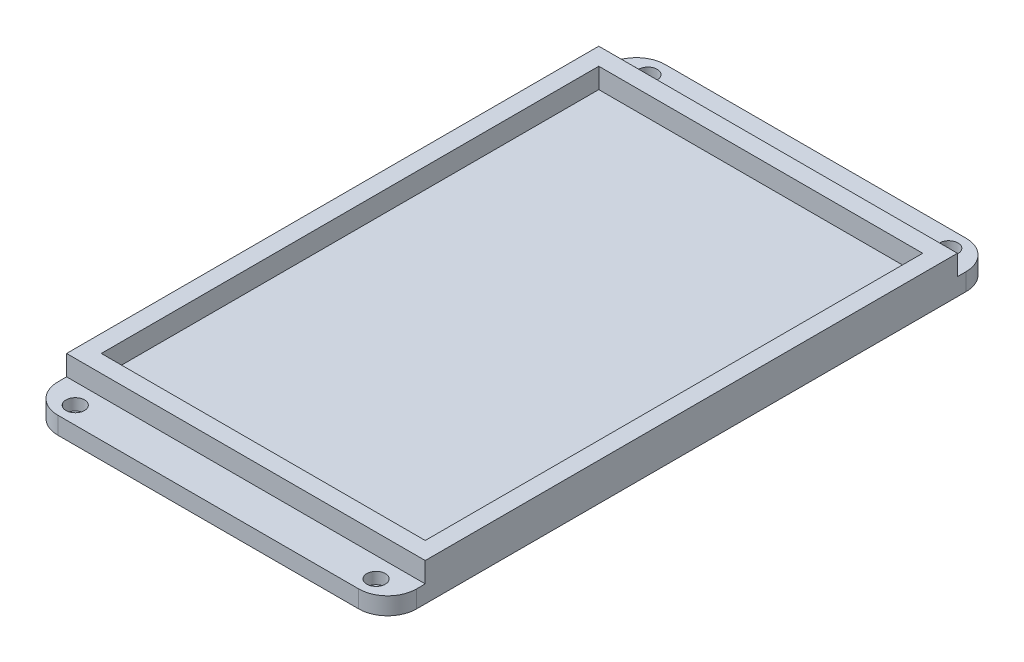
ISO-10303-21;
HEADER;
FILE_DESCRIPTION(('STEP AP214'),'2;1');
FILE_NAME('part.step','',(''),(''),'','','');
FILE_SCHEMA(('AUTOMOTIVE_DESIGN { 1 0 10303 214 1 1 1 1 }'));
ENDSEC;
DATA;
#1=APPLICATION_CONTEXT('core data for automotive mechanical design processes');
#2=APPLICATION_PROTOCOL_DEFINITION('international standard','automotive_design',2000,#1);
#3=PRODUCT_CONTEXT('',#1,'mechanical');
#4=PRODUCT('Part','Part','',(#3));
#5=PRODUCT_RELATED_PRODUCT_CATEGORY('part','',(#4));
#6=PRODUCT_DEFINITION_FORMATION('','',#4);
#7=PRODUCT_DEFINITION_CONTEXT('part definition',#1,'design');
#8=PRODUCT_DEFINITION('design','',#6,#7);
#9=PRODUCT_DEFINITION_SHAPE('','',#8);
#10=(LENGTH_UNIT() NAMED_UNIT(*) SI_UNIT(.MILLI.,.METRE.));
#11=(NAMED_UNIT(*) PLANE_ANGLE_UNIT() SI_UNIT($,.RADIAN.));
#12=(NAMED_UNIT(*) SI_UNIT($,.STERADIAN.) SOLID_ANGLE_UNIT());
#13=UNCERTAINTY_MEASURE_WITH_UNIT(LENGTH_MEASURE(1.E-05),#10,'distance_accuracy_value','');
#14=(GEOMETRIC_REPRESENTATION_CONTEXT(3) GLOBAL_UNCERTAINTY_ASSIGNED_CONTEXT((#13)) GLOBAL_UNIT_ASSIGNED_CONTEXT((#10,
#11,#12)) REPRESENTATION_CONTEXT('',''));
#15=CARTESIAN_POINT('',(0.,0.,0.));
#16=DIRECTION('',(0.,0.,1.));
#17=DIRECTION('',(1.,0.,0.));
#18=AXIS2_PLACEMENT_3D('',#15,#16,#17);
#19=CARTESIAN_POINT('',(0.,3.5,0.));
#20=DIRECTION('',(0.,-1.,0.));
#21=DIRECTION('',(0.,0.,-1.));
#22=AXIS2_PLACEMENT_3D('',#19,#20,#21);
#23=PLANE('',#22);
#24=DIRECTION('',(0.,0.,-1.));
#25=VECTOR('',#24,1.);
#26=CARTESIAN_POINT('',(31.,3.5,46.));
#27=LINE('',#26,#25);
#28=CARTESIAN_POINT('',(31.,3.5,46.));
#29=VERTEX_POINT('',#28);
#30=CARTESIAN_POINT('',(31.,3.5,-46.));
#31=VERTEX_POINT('',#30);
#32=EDGE_CURVE('E262',#29,#31,#27,.T.);
#33=ORIENTED_EDGE('',*,*,#32,.T.);
#34=DIRECTION('',(-1.,0.,0.));
#35=VECTOR('',#34,1.);
#36=CARTESIAN_POINT('',(-31.,3.5,-46.));
#37=LINE('',#36,#35);
#38=CARTESIAN_POINT('',(-31.,3.5,-46.));
#39=VERTEX_POINT('',#38);
#40=EDGE_CURVE('E178',#31,#39,#37,.T.);
#41=ORIENTED_EDGE('',*,*,#40,.T.);
#42=DIRECTION('',(0.,0.,1.));
#43=VECTOR('',#42,1.);
#44=CARTESIAN_POINT('',(-31.,3.5,46.));
#45=LINE('',#44,#43);
#46=CARTESIAN_POINT('',(-31.,3.5,46.));
#47=VERTEX_POINT('',#46);
#48=EDGE_CURVE('E265',#39,#47,#45,.T.);
#49=ORIENTED_EDGE('',*,*,#48,.T.);
#50=DIRECTION('',(1.,0.,0.));
#51=VECTOR('',#50,1.);
#52=CARTESIAN_POINT('',(-31.,3.5,46.));
#53=LINE('',#52,#51);
#54=EDGE_CURVE('E267',#47,#29,#53,.T.);
#55=ORIENTED_EDGE('',*,*,#54,.T.);
#56=EDGE_LOOP('',(#33,#41,#49,#55));
#57=FACE_BOUND('',#56,.T.);
#58=DIRECTION('',(0.,0.,-1.));
#59=VECTOR('',#58,1.);
#60=CARTESIAN_POINT('',(28.,3.5,43.));
#61=LINE('',#60,#59);
#62=CARTESIAN_POINT('',(28.,3.5,43.));
#63=VERTEX_POINT('',#62);
#64=CARTESIAN_POINT('',(28.,3.5,-43.));
#65=VERTEX_POINT('',#64);
#66=EDGE_CURVE('E230',#63,#65,#61,.T.);
#67=ORIENTED_EDGE('',*,*,#66,.F.);
#68=DIRECTION('',(1.,0.,0.));
#69=VECTOR('',#68,1.);
#70=CARTESIAN_POINT('',(-28.,3.5,43.));
#71=LINE('',#70,#69);
#72=CARTESIAN_POINT('',(-28.,3.5,43.));
#73=VERTEX_POINT('',#72);
#74=EDGE_CURVE('E238',#73,#63,#71,.T.);
#75=ORIENTED_EDGE('',*,*,#74,.F.);
#76=DIRECTION('',(0.,0.,1.));
#77=VECTOR('',#76,1.);
#78=CARTESIAN_POINT('',(-28.,3.5,43.));
#79=LINE('',#78,#77);
#80=CARTESIAN_POINT('',(-28.,3.5,-43.));
#81=VERTEX_POINT('',#80);
#82=EDGE_CURVE('E235',#81,#73,#79,.T.);
#83=ORIENTED_EDGE('',*,*,#82,.F.);
#84=DIRECTION('',(-1.,0.,0.));
#85=VECTOR('',#84,1.);
#86=CARTESIAN_POINT('',(-28.,3.5,-43.));
#87=LINE('',#86,#85);
#88=EDGE_CURVE('E232',#65,#81,#87,.T.);
#89=ORIENTED_EDGE('',*,*,#88,.F.);
#90=EDGE_LOOP('',(#67,#75,#83,#89));
#91=FACE_BOUND('',#90,.T.);
#92=ADVANCED_FACE('F38',(#57,#91),#23,.F.);
#93=CARTESIAN_POINT('',(31.,3.5,46.));
#94=DIRECTION('',(-1.,0.,0.));
#95=DIRECTION('',(0.,0.,1.));
#96=AXIS2_PLACEMENT_3D('',#93,#94,#95);
#97=PLANE('',#96);
#98=DIRECTION('',(0.,0.,1.));
#99=VECTOR('',#98,1.);
#100=CARTESIAN_POINT('',(31.,-3.,-52.5));
#101=LINE('',#100,#99);
#102=CARTESIAN_POINT('',(31.,-3.,-47.5));
#103=VERTEX_POINT('',#102);
#104=CARTESIAN_POINT('',(31.,-3.,47.5));
#105=VERTEX_POINT('',#104);
#106=EDGE_CURVE('E229',#103,#105,#101,.T.);
#107=ORIENTED_EDGE('',*,*,#106,.F.);
#108=DIRECTION('',(0.,1.,0.));
#109=VECTOR('',#108,1.);
#110=CARTESIAN_POINT('',(31.,3.5,-47.5));
#111=LINE('',#110,#109);
#112=CARTESIAN_POINT('',(31.,0.,-47.5));
#113=VERTEX_POINT('',#112);
#114=EDGE_CURVE('E161',#103,#113,#111,.T.);
#115=ORIENTED_EDGE('',*,*,#114,.T.);
#116=DIRECTION('',(0.,0.,1.));
#117=VECTOR('',#116,1.);
#118=CARTESIAN_POINT('',(31.,0.,-52.5));
#119=LINE('',#118,#117);
#120=CARTESIAN_POINT('',(31.,0.,-46.));
#121=VERTEX_POINT('',#120);
#122=EDGE_CURVE('E153',#113,#121,#119,.T.);
#123=ORIENTED_EDGE('',*,*,#122,.T.);
#124=DIRECTION('',(0.,-1.,0.));
#125=VECTOR('',#124,1.);
#126=CARTESIAN_POINT('',(31.,3.5,-46.));
#127=LINE('',#126,#125);
#128=EDGE_CURVE('E159',#31,#121,#127,.T.);
#129=ORIENTED_EDGE('',*,*,#128,.F.);
#130=ORIENTED_EDGE('',*,*,#32,.F.);
#131=DIRECTION('',(0.,-1.,0.));
#132=VECTOR('',#131,1.);
#133=CARTESIAN_POINT('',(31.,3.5,46.));
#134=LINE('',#133,#132);
#135=CARTESIAN_POINT('',(31.,0.,46.));
#136=VERTEX_POINT('',#135);
#137=EDGE_CURVE('E268',#29,#136,#134,.T.);
#138=ORIENTED_EDGE('',*,*,#137,.T.);
#139=CARTESIAN_POINT('',(31.,0.,47.5));
#140=VERTEX_POINT('',#139);
#141=EDGE_CURVE('E164',#136,#140,#119,.T.);
#142=ORIENTED_EDGE('',*,*,#141,.T.);
#143=DIRECTION('',(0.,1.,0.));
#144=VECTOR('',#143,1.);
#145=CARTESIAN_POINT('',(31.,3.5,47.5));
#146=LINE('',#145,#144);
#147=EDGE_CURVE('E180',#140,#105,#146,.F.);
#148=ORIENTED_EDGE('',*,*,#147,.T.);
#149=EDGE_LOOP('',(#107,#115,#123,#129,#130,#138,#142,#148));
#150=FACE_BOUND('',#149,.T.);
#151=ADVANCED_FACE('F156',(#150),#97,.F.);
#152=CARTESIAN_POINT('',(-31.,3.5,-46.));
#153=DIRECTION('',(0.,0.,1.));
#154=DIRECTION('',(1.,0.,0.));
#155=AXIS2_PLACEMENT_3D('',#152,#153,#154);
#156=PLANE('',#155);
#157=DIRECTION('',(-1.,0.,0.));
#158=VECTOR('',#157,1.);
#159=CARTESIAN_POINT('',(-31.,0.,-46.));
#160=LINE('',#159,#158);
#161=CARTESIAN_POINT('',(-31.,0.,-46.));
#162=VERTEX_POINT('',#161);
#163=EDGE_CURVE('E167',#121,#162,#160,.T.);
#164=ORIENTED_EDGE('',*,*,#163,.T.);
#165=DIRECTION('',(0.,-1.,0.));
#166=VECTOR('',#165,1.);
#167=CARTESIAN_POINT('',(-31.,3.5,-46.));
#168=LINE('',#167,#166);
#169=EDGE_CURVE('E181',#39,#162,#168,.T.);
#170=ORIENTED_EDGE('',*,*,#169,.F.);
#171=ORIENTED_EDGE('',*,*,#40,.F.);
#172=ORIENTED_EDGE('',*,*,#128,.T.);
#173=EDGE_LOOP('',(#164,#170,#171,#172));
#174=FACE_BOUND('',#173,.T.);
#175=ADVANCED_FACE('F177',(#174),#156,.F.);
#176=CARTESIAN_POINT('',(-31.,3.5,46.));
#177=DIRECTION('',(1.,0.,0.));
#178=DIRECTION('',(0.,0.,-1.));
#179=AXIS2_PLACEMENT_3D('',#176,#177,#178);
#180=PLANE('',#179);
#181=DIRECTION('',(0.,0.,-1.));
#182=VECTOR('',#181,1.);
#183=CARTESIAN_POINT('',(-31.,0.,-52.5));
#184=LINE('',#183,#182);
#185=CARTESIAN_POINT('',(-31.,0.,-47.5));
#186=VERTEX_POINT('',#185);
#187=EDGE_CURVE('E170',#162,#186,#184,.T.);
#188=ORIENTED_EDGE('',*,*,#187,.T.);
#189=DIRECTION('',(0.,1.,0.));
#190=VECTOR('',#189,1.);
#191=CARTESIAN_POINT('',(-31.,3.5,-47.5));
#192=LINE('',#191,#190);
#193=CARTESIAN_POINT('',(-31.,-3.,-47.5));
#194=VERTEX_POINT('',#193);
#195=EDGE_CURVE('E209',#186,#194,#192,.F.);
#196=ORIENTED_EDGE('',*,*,#195,.T.);
#197=DIRECTION('',(0.,0.,-1.));
#198=VECTOR('',#197,1.);
#199=CARTESIAN_POINT('',(-31.,-3.,-52.5));
#200=LINE('',#199,#198);
#201=CARTESIAN_POINT('',(-31.,-3.,47.5));
#202=VERTEX_POINT('',#201);
#203=EDGE_CURVE('E301',#202,#194,#200,.T.);
#204=ORIENTED_EDGE('',*,*,#203,.F.);
#205=DIRECTION('',(0.,1.,0.));
#206=VECTOR('',#205,1.);
#207=CARTESIAN_POINT('',(-31.,3.5,47.5));
#208=LINE('',#207,#206);
#209=CARTESIAN_POINT('',(-31.,0.,47.5));
#210=VERTEX_POINT('',#209);
#211=EDGE_CURVE('E206',#202,#210,#208,.T.);
#212=ORIENTED_EDGE('',*,*,#211,.T.);
#213=CARTESIAN_POINT('',(-31.,0.,46.));
#214=VERTEX_POINT('',#213);
#215=EDGE_CURVE('E222',#210,#214,#184,.T.);
#216=ORIENTED_EDGE('',*,*,#215,.T.);
#217=DIRECTION('',(0.,-1.,0.));
#218=VECTOR('',#217,1.);
#219=CARTESIAN_POINT('',(-31.,3.5,46.));
#220=LINE('',#219,#218);
#221=EDGE_CURVE('E184',#47,#214,#220,.T.);
#222=ORIENTED_EDGE('',*,*,#221,.F.);
#223=ORIENTED_EDGE('',*,*,#48,.F.);
#224=ORIENTED_EDGE('',*,*,#169,.T.);
#225=EDGE_LOOP('',(#188,#196,#204,#212,#216,#222,#223,#224));
#226=FACE_BOUND('',#225,.T.);
#227=ADVANCED_FACE('F282',(#226),#180,.F.);
#228=CARTESIAN_POINT('',(-31.,3.5,46.));
#229=DIRECTION('',(0.,0.,-1.));
#230=DIRECTION('',(-1.,0.,0.));
#231=AXIS2_PLACEMENT_3D('',#228,#229,#230);
#232=PLANE('',#231);
#233=DIRECTION('',(1.,0.,0.));
#234=VECTOR('',#233,1.);
#235=CARTESIAN_POINT('',(-31.,0.,46.));
#236=LINE('',#235,#234);
#237=EDGE_CURVE('E174',#214,#136,#236,.T.);
#238=ORIENTED_EDGE('',*,*,#237,.T.);
#239=ORIENTED_EDGE('',*,*,#137,.F.);
#240=ORIENTED_EDGE('',*,*,#54,.F.);
#241=ORIENTED_EDGE('',*,*,#221,.T.);
#242=EDGE_LOOP('',(#238,#239,#240,#241));
#243=FACE_BOUND('',#242,.T.);
#244=ADVANCED_FACE('F277',(#243),#232,.F.);
#245=CARTESIAN_POINT('',(28.,3.5,43.));
#246=DIRECTION('',(-1.,0.,0.));
#247=DIRECTION('',(0.,0.,1.));
#248=AXIS2_PLACEMENT_3D('',#245,#246,#247);
#249=PLANE('',#248);
#250=DIRECTION('',(0.,0.,-1.));
#251=VECTOR('',#250,1.);
#252=CARTESIAN_POINT('',(28.,0.,43.));
#253=LINE('',#252,#251);
#254=CARTESIAN_POINT('',(28.,0.,43.));
#255=VERTEX_POINT('',#254);
#256=CARTESIAN_POINT('',(28.,0.,-43.));
#257=VERTEX_POINT('',#256);
#258=EDGE_CURVE('E241',#255,#257,#253,.T.);
#259=ORIENTED_EDGE('',*,*,#258,.F.);
#260=DIRECTION('',(0.,-1.,0.));
#261=VECTOR('',#260,1.);
#262=CARTESIAN_POINT('',(28.,3.5,43.));
#263=LINE('',#262,#261);
#264=EDGE_CURVE('E240',#63,#255,#263,.T.);
#265=ORIENTED_EDGE('',*,*,#264,.F.);
#266=ORIENTED_EDGE('',*,*,#66,.T.);
#267=DIRECTION('',(0.,-1.,0.));
#268=VECTOR('',#267,1.);
#269=CARTESIAN_POINT('',(28.,3.5,-43.));
#270=LINE('',#269,#268);
#271=EDGE_CURVE('E175',#65,#257,#270,.T.);
#272=ORIENTED_EDGE('',*,*,#271,.T.);
#273=EDGE_LOOP('',(#259,#265,#266,#272));
#274=FACE_BOUND('',#273,.T.);
#275=ADVANCED_FACE('F339',(#274),#249,.T.);
#276=CARTESIAN_POINT('',(-28.,3.5,-43.));
#277=DIRECTION('',(0.,0.,1.));
#278=DIRECTION('',(1.,0.,0.));
#279=AXIS2_PLACEMENT_3D('',#276,#277,#278);
#280=PLANE('',#279);
#281=DIRECTION('',(-1.,0.,0.));
#282=VECTOR('',#281,1.);
#283=CARTESIAN_POINT('',(-28.,0.,-43.));
#284=LINE('',#283,#282);
#285=CARTESIAN_POINT('',(-28.,0.,-43.));
#286=VERTEX_POINT('',#285);
#287=EDGE_CURVE('E244',#257,#286,#284,.T.);
#288=ORIENTED_EDGE('',*,*,#287,.F.);
#289=ORIENTED_EDGE('',*,*,#271,.F.);
#290=ORIENTED_EDGE('',*,*,#88,.T.);
#291=DIRECTION('',(0.,-1.,0.));
#292=VECTOR('',#291,1.);
#293=CARTESIAN_POINT('',(-28.,3.5,-43.));
#294=LINE('',#293,#292);
#295=EDGE_CURVE('E258',#81,#286,#294,.T.);
#296=ORIENTED_EDGE('',*,*,#295,.T.);
#297=EDGE_LOOP('',(#288,#289,#290,#296));
#298=FACE_BOUND('',#297,.T.);
#299=ADVANCED_FACE('F371',(#298),#280,.T.);
#300=CARTESIAN_POINT('',(-28.,3.5,43.));
#301=DIRECTION('',(1.,0.,0.));
#302=DIRECTION('',(0.,0.,-1.));
#303=AXIS2_PLACEMENT_3D('',#300,#301,#302);
#304=PLANE('',#303);
#305=DIRECTION('',(0.,0.,1.));
#306=VECTOR('',#305,1.);
#307=CARTESIAN_POINT('',(-28.,0.,43.));
#308=LINE('',#307,#306);
#309=CARTESIAN_POINT('',(-28.,0.,43.));
#310=VERTEX_POINT('',#309);
#311=EDGE_CURVE('E248',#286,#310,#308,.T.);
#312=ORIENTED_EDGE('',*,*,#311,.F.);
#313=ORIENTED_EDGE('',*,*,#295,.F.);
#314=ORIENTED_EDGE('',*,*,#82,.T.);
#315=DIRECTION('',(0.,-1.,0.));
#316=VECTOR('',#315,1.);
#317=CARTESIAN_POINT('',(-28.,3.5,43.));
#318=LINE('',#317,#316);
#319=EDGE_CURVE('E255',#73,#310,#318,.T.);
#320=ORIENTED_EDGE('',*,*,#319,.T.);
#321=EDGE_LOOP('',(#312,#313,#314,#320));
#322=FACE_BOUND('',#321,.T.);
#323=ADVANCED_FACE('F368',(#322),#304,.T.);
#324=CARTESIAN_POINT('',(-28.,3.5,43.));
#325=DIRECTION('',(0.,0.,-1.));
#326=DIRECTION('',(-1.,0.,0.));
#327=AXIS2_PLACEMENT_3D('',#324,#325,#326);
#328=PLANE('',#327);
#329=DIRECTION('',(1.,0.,0.));
#330=VECTOR('',#329,1.);
#331=CARTESIAN_POINT('',(-28.,0.,43.));
#332=LINE('',#331,#330);
#333=EDGE_CURVE('E233',#310,#255,#332,.T.);
#334=ORIENTED_EDGE('',*,*,#333,.F.);
#335=ORIENTED_EDGE('',*,*,#319,.F.);
#336=ORIENTED_EDGE('',*,*,#74,.T.);
#337=ORIENTED_EDGE('',*,*,#264,.T.);
#338=EDGE_LOOP('',(#334,#335,#336,#337));
#339=FACE_BOUND('',#338,.T.);
#340=ADVANCED_FACE('F361',(#339),#328,.T.);
#341=CARTESIAN_POINT('',(0.,0.,0.));
#342=DIRECTION('',(0.,1.,0.));
#343=DIRECTION('',(0.,0.,1.));
#344=AXIS2_PLACEMENT_3D('',#341,#342,#343);
#345=PLANE('',#344);
#346=ORIENTED_EDGE('',*,*,#311,.T.);
#347=ORIENTED_EDGE('',*,*,#333,.T.);
#348=ORIENTED_EDGE('',*,*,#258,.T.);
#349=ORIENTED_EDGE('',*,*,#287,.T.);
#350=EDGE_LOOP('',(#346,#347,#348,#349));
#351=FACE_BOUND('',#350,.T.);
#352=ADVANCED_FACE('F359',(#351),#345,.T.);
#353=CARTESIAN_POINT('',(-26.,0.,49.5));
#354=DIRECTION('',(0.,1.,0.));
#355=DIRECTION('',(0.,0.,-1.));
#356=AXIS2_PLACEMENT_3D('',#353,#354,#355);
#357=CIRCLE('',#356,1.6);
#358=CARTESIAN_POINT('',(-26.,0.,47.9));
#359=VERTEX_POINT('',#358);
#360=EDGE_CURVE('E633',#359,#359,#357,.T.);
#361=ORIENTED_EDGE('',*,*,#360,.F.);
#362=EDGE_LOOP('',(#361));
#363=FACE_BOUND('',#362,.T.);
#364=CARTESIAN_POINT('',(26.,0.,49.5));
#365=DIRECTION('',(0.,1.,0.));
#366=DIRECTION('',(0.,0.,1.));
#367=AXIS2_PLACEMENT_3D('',#364,#365,#366);
#368=CIRCLE('',#367,1.6);
#369=CARTESIAN_POINT('',(26.,0.,51.1));
#370=VERTEX_POINT('',#369);
#371=EDGE_CURVE('E639',#370,#370,#368,.T.);
#372=ORIENTED_EDGE('',*,*,#371,.F.);
#373=EDGE_LOOP('',(#372));
#374=FACE_BOUND('',#373,.T.);
#375=ORIENTED_EDGE('',*,*,#215,.F.);
#376=CARTESIAN_POINT('',(-26.,0.,47.5));
#377=DIRECTION('',(0.,1.,0.));
#378=DIRECTION('',(0.,0.,1.));
#379=AXIS2_PLACEMENT_3D('',#376,#377,#378);
#380=CIRCLE('',#379,5.);
#381=CARTESIAN_POINT('',(-26.,0.,52.5));
#382=VERTEX_POINT('',#381);
#383=EDGE_CURVE('E53',#210,#382,#380,.T.);
#384=ORIENTED_EDGE('',*,*,#383,.T.);
#385=DIRECTION('',(-1.,0.,0.));
#386=VECTOR('',#385,1.);
#387=CARTESIAN_POINT('',(-31.,0.,52.5));
#388=LINE('',#387,#386);
#389=CARTESIAN_POINT('',(26.,0.,52.5));
#390=VERTEX_POINT('',#389);
#391=EDGE_CURVE('E163',#390,#382,#388,.T.);
#392=ORIENTED_EDGE('',*,*,#391,.F.);
#393=CARTESIAN_POINT('',(26.,0.,47.5));
#394=DIRECTION('',(0.,1.,0.));
#395=DIRECTION('',(0.,0.,1.));
#396=AXIS2_PLACEMENT_3D('',#393,#394,#395);
#397=CIRCLE('',#396,5.);
#398=EDGE_CURVE('E61',#390,#140,#397,.T.);
#399=ORIENTED_EDGE('',*,*,#398,.T.);
#400=ORIENTED_EDGE('',*,*,#141,.F.);
#401=ORIENTED_EDGE('',*,*,#237,.F.);
#402=EDGE_LOOP('',(#375,#384,#392,#399,#400,#401));
#403=FACE_BOUND('',#402,.T.);
#404=ADVANCED_FACE('F219',(#363,#374,#403),#345,.T.);
#405=CARTESIAN_POINT('',(26.,0.,-49.5));
#406=DIRECTION('',(0.,1.,0.));
#407=DIRECTION('',(0.,0.,-1.));
#408=AXIS2_PLACEMENT_3D('',#405,#406,#407);
#409=CIRCLE('',#408,1.6);
#410=CARTESIAN_POINT('',(26.,0.,-51.1));
#411=VERTEX_POINT('',#410);
#412=EDGE_CURVE('E292',#411,#411,#409,.T.);
#413=ORIENTED_EDGE('',*,*,#412,.F.);
#414=EDGE_LOOP('',(#413));
#415=FACE_BOUND('',#414,.T.);
#416=CARTESIAN_POINT('',(-26.,0.,-49.5));
#417=DIRECTION('',(0.,1.,0.));
#418=DIRECTION('',(0.,0.,1.));
#419=AXIS2_PLACEMENT_3D('',#416,#417,#418);
#420=CIRCLE('',#419,1.6);
#421=CARTESIAN_POINT('',(-26.,0.,-47.9));
#422=VERTEX_POINT('',#421);
#423=EDGE_CURVE('E287',#422,#422,#420,.T.);
#424=ORIENTED_EDGE('',*,*,#423,.F.);
#425=EDGE_LOOP('',(#424));
#426=FACE_BOUND('',#425,.T.);
#427=ORIENTED_EDGE('',*,*,#122,.F.);
#428=CARTESIAN_POINT('',(26.,0.,-47.5));
#429=DIRECTION('',(0.,1.,0.));
#430=DIRECTION('',(0.,0.,1.));
#431=AXIS2_PLACEMENT_3D('',#428,#429,#430);
#432=CIRCLE('',#431,5.);
#433=CARTESIAN_POINT('',(26.,0.,-52.5));
#434=VERTEX_POINT('',#433);
#435=EDGE_CURVE('E191',#113,#434,#432,.T.);
#436=ORIENTED_EDGE('',*,*,#435,.T.);
#437=DIRECTION('',(1.,0.,0.));
#438=VECTOR('',#437,1.);
#439=CARTESIAN_POINT('',(-31.,0.,-52.5));
#440=LINE('',#439,#438);
#441=CARTESIAN_POINT('',(-26.,0.,-52.5));
#442=VERTEX_POINT('',#441);
#443=EDGE_CURVE('E226',#442,#434,#440,.T.);
#444=ORIENTED_EDGE('',*,*,#443,.F.);
#445=CARTESIAN_POINT('',(-26.,0.,-47.5));
#446=DIRECTION('',(0.,1.,0.));
#447=DIRECTION('',(0.,0.,1.));
#448=AXIS2_PLACEMENT_3D('',#445,#446,#447);
#449=CIRCLE('',#448,5.);
#450=EDGE_CURVE('E189',#442,#186,#449,.T.);
#451=ORIENTED_EDGE('',*,*,#450,.T.);
#452=ORIENTED_EDGE('',*,*,#187,.F.);
#453=ORIENTED_EDGE('',*,*,#163,.F.);
#454=EDGE_LOOP('',(#427,#436,#444,#451,#452,#453));
#455=FACE_BOUND('',#454,.T.);
#456=ADVANCED_FACE('F168',(#415,#426,#455),#345,.T.);
#457=CARTESIAN_POINT('',(-31.,-3.,52.5));
#458=DIRECTION('',(0.,0.,-1.));
#459=DIRECTION('',(-1.,0.,0.));
#460=AXIS2_PLACEMENT_3D('',#457,#458,#459);
#461=PLANE('',#460);
#462=ORIENTED_EDGE('',*,*,#391,.T.);
#463=DIRECTION('',(0.,1.,0.));
#464=VECTOR('',#463,1.);
#465=CARTESIAN_POINT('',(-26.,-3.,52.5));
#466=LINE('',#465,#464);
#467=CARTESIAN_POINT('',(-26.,-3.,52.5));
#468=VERTEX_POINT('',#467);
#469=EDGE_CURVE('E11',#382,#468,#466,.F.);
#470=ORIENTED_EDGE('',*,*,#469,.T.);
#471=DIRECTION('',(-1.,0.,0.));
#472=VECTOR('',#471,1.);
#473=CARTESIAN_POINT('',(-31.,-3.,52.5));
#474=LINE('',#473,#472);
#475=CARTESIAN_POINT('',(26.,-3.,52.5));
#476=VERTEX_POINT('',#475);
#477=EDGE_CURVE('E217',#476,#468,#474,.T.);
#478=ORIENTED_EDGE('',*,*,#477,.F.);
#479=DIRECTION('',(0.,1.,0.));
#480=VECTOR('',#479,1.);
#481=CARTESIAN_POINT('',(26.,-3.,52.5));
#482=LINE('',#481,#480);
#483=EDGE_CURVE('E46',#476,#390,#482,.T.);
#484=ORIENTED_EDGE('',*,*,#483,.T.);
#485=EDGE_LOOP('',(#462,#470,#478,#484));
#486=FACE_BOUND('',#485,.T.);
#487=ADVANCED_FACE('F214',(#486),#461,.F.);
#488=CARTESIAN_POINT('',(-31.,-3.,-52.5));
#489=DIRECTION('',(0.,0.,1.));
#490=DIRECTION('',(1.,0.,0.));
#491=AXIS2_PLACEMENT_3D('',#488,#489,#490);
#492=PLANE('',#491);
#493=ORIENTED_EDGE('',*,*,#443,.T.);
#494=DIRECTION('',(0.,1.,0.));
#495=VECTOR('',#494,1.);
#496=CARTESIAN_POINT('',(26.,-3.,-52.5));
#497=LINE('',#496,#495);
#498=CARTESIAN_POINT('',(26.,-3.,-52.5));
#499=VERTEX_POINT('',#498);
#500=EDGE_CURVE('E196',#434,#499,#497,.F.);
#501=ORIENTED_EDGE('',*,*,#500,.T.);
#502=DIRECTION('',(1.,0.,0.));
#503=VECTOR('',#502,1.);
#504=CARTESIAN_POINT('',(-31.,-3.,-52.5));
#505=LINE('',#504,#503);
#506=CARTESIAN_POINT('',(-26.,-3.,-52.5));
#507=VERTEX_POINT('',#506);
#508=EDGE_CURVE('E245',#507,#499,#505,.T.);
#509=ORIENTED_EDGE('',*,*,#508,.F.);
#510=DIRECTION('',(0.,1.,0.));
#511=VECTOR('',#510,1.);
#512=CARTESIAN_POINT('',(-26.,-3.,-52.5));
#513=LINE('',#512,#511);
#514=EDGE_CURVE('E193',#507,#442,#513,.T.);
#515=ORIENTED_EDGE('',*,*,#514,.T.);
#516=EDGE_LOOP('',(#493,#501,#509,#515));
#517=FACE_BOUND('',#516,.T.);
#518=ADVANCED_FACE('F315',(#517),#492,.F.);
#519=CARTESIAN_POINT('',(0.,-3.,0.));
#520=DIRECTION('',(0.,1.,0.));
#521=DIRECTION('',(0.,0.,1.));
#522=AXIS2_PLACEMENT_3D('',#519,#520,#521);
#523=PLANE('',#522);
#524=ORIENTED_EDGE('',*,*,#508,.T.);
#525=CARTESIAN_POINT('',(26.,-3.,-47.5));
#526=DIRECTION('',(0.,1.,0.));
#527=DIRECTION('',(0.,0.,1.));
#528=AXIS2_PLACEMENT_3D('',#525,#526,#527);
#529=CIRCLE('',#528,5.);
#530=EDGE_CURVE('E204',#499,#103,#529,.F.);
#531=ORIENTED_EDGE('',*,*,#530,.T.);
#532=ORIENTED_EDGE('',*,*,#106,.T.);
#533=CARTESIAN_POINT('',(26.,-3.,47.5));
#534=DIRECTION('',(0.,1.,0.));
#535=DIRECTION('',(0.,0.,1.));
#536=AXIS2_PLACEMENT_3D('',#533,#534,#535);
#537=CIRCLE('',#536,5.);
#538=EDGE_CURVE('E198',#105,#476,#537,.F.);
#539=ORIENTED_EDGE('',*,*,#538,.T.);
#540=ORIENTED_EDGE('',*,*,#477,.T.);
#541=CARTESIAN_POINT('',(-26.,-3.,47.5));
#542=DIRECTION('',(0.,1.,0.));
#543=DIRECTION('',(0.,0.,1.));
#544=AXIS2_PLACEMENT_3D('',#541,#542,#543);
#545=CIRCLE('',#544,5.);
#546=EDGE_CURVE('E200',#468,#202,#545,.F.);
#547=ORIENTED_EDGE('',*,*,#546,.T.);
#548=ORIENTED_EDGE('',*,*,#203,.T.);
#549=CARTESIAN_POINT('',(-26.,-3.,-47.5));
#550=DIRECTION('',(0.,1.,0.));
#551=DIRECTION('',(0.,0.,1.));
#552=AXIS2_PLACEMENT_3D('',#549,#550,#551);
#553=CIRCLE('',#552,5.);
#554=EDGE_CURVE('E202',#194,#507,#553,.F.);
#555=ORIENTED_EDGE('',*,*,#554,.T.);
#556=EDGE_LOOP('',(#524,#531,#532,#539,#540,#547,#548,#555));
#557=FACE_BOUND('',#556,.T.);
#558=ADVANCED_FACE('F307',(#557),#523,.F.);
#559=CARTESIAN_POINT('',(26.,3.5,-47.5));
#560=DIRECTION('',(0.,1.,0.));
#561=DIRECTION('',(0.,0.,1.));
#562=AXIS2_PLACEMENT_3D('',#559,#560,#561);
#563=CYLINDRICAL_SURFACE('',#562,5.);
#564=ORIENTED_EDGE('',*,*,#530,.F.);
#565=ORIENTED_EDGE('',*,*,#500,.F.);
#566=ORIENTED_EDGE('',*,*,#435,.F.);
#567=ORIENTED_EDGE('',*,*,#114,.F.);
#568=EDGE_LOOP('',(#564,#565,#566,#567));
#569=FACE_BOUND('',#568,.T.);
#570=ADVANCED_FACE('F313',(#569),#563,.T.);
#571=CARTESIAN_POINT('',(-26.,-3.,-47.5));
#572=DIRECTION('',(0.,1.,0.));
#573=DIRECTION('',(0.,0.,1.));
#574=AXIS2_PLACEMENT_3D('',#571,#572,#573);
#575=CYLINDRICAL_SURFACE('',#574,5.);
#576=ORIENTED_EDGE('',*,*,#554,.F.);
#577=ORIENTED_EDGE('',*,*,#195,.F.);
#578=ORIENTED_EDGE('',*,*,#450,.F.);
#579=ORIENTED_EDGE('',*,*,#514,.F.);
#580=EDGE_LOOP('',(#576,#577,#578,#579));
#581=FACE_BOUND('',#580,.T.);
#582=ADVANCED_FACE('F317',(#581),#575,.T.);
#583=CARTESIAN_POINT('',(-26.,3.5,47.5));
#584=DIRECTION('',(0.,1.,0.));
#585=DIRECTION('',(0.,0.,1.));
#586=AXIS2_PLACEMENT_3D('',#583,#584,#585);
#587=CYLINDRICAL_SURFACE('',#586,5.);
#588=ORIENTED_EDGE('',*,*,#546,.F.);
#589=ORIENTED_EDGE('',*,*,#469,.F.);
#590=ORIENTED_EDGE('',*,*,#383,.F.);
#591=ORIENTED_EDGE('',*,*,#211,.F.);
#592=EDGE_LOOP('',(#588,#589,#590,#591));
#593=FACE_BOUND('',#592,.T.);
#594=ADVANCED_FACE('F321',(#593),#587,.T.);
#595=CARTESIAN_POINT('',(26.,-3.,47.5));
#596=DIRECTION('',(0.,1.,0.));
#597=DIRECTION('',(0.,0.,1.));
#598=AXIS2_PLACEMENT_3D('',#595,#596,#597);
#599=CYLINDRICAL_SURFACE('',#598,5.);
#600=ORIENTED_EDGE('',*,*,#538,.F.);
#601=ORIENTED_EDGE('',*,*,#147,.F.);
#602=ORIENTED_EDGE('',*,*,#398,.F.);
#603=ORIENTED_EDGE('',*,*,#483,.F.);
#604=EDGE_LOOP('',(#600,#601,#602,#603));
#605=FACE_BOUND('',#604,.T.);
#606=ADVANCED_FACE('F40',(#605),#599,.T.);
#607=CARTESIAN_POINT('',(-26.,-2.,-49.5));
#608=DIRECTION('',(0.,1.,0.));
#609=DIRECTION('',(0.,0.,1.));
#610=AXIS2_PLACEMENT_3D('',#607,#608,#609);
#611=CYLINDRICAL_SURFACE('',#610,1.6);
#612=CARTESIAN_POINT('',(-26.,-2.,-49.5));
#613=DIRECTION('',(0.,1.,0.));
#614=DIRECTION('',(0.,0.,1.));
#615=AXIS2_PLACEMENT_3D('',#612,#613,#614);
#616=CIRCLE('',#615,1.6);
#617=CARTESIAN_POINT('',(-26.,-2.,-47.9));
#618=VERTEX_POINT('',#617);
#619=EDGE_CURVE('E285',#618,#618,#616,.T.);
#620=ORIENTED_EDGE('',*,*,#619,.F.);
#621=EDGE_LOOP('',(#620));
#622=FACE_BOUND('',#621,.T.);
#623=ORIENTED_EDGE('',*,*,#423,.T.);
#624=EDGE_LOOP('',(#623));
#625=FACE_BOUND('',#624,.T.);
#626=ADVANCED_FACE('F327',(#622,#625),#611,.F.);
#627=CARTESIAN_POINT('',(-26.,-2.,-49.5));
#628=DIRECTION('',(0.,1.,0.));
#629=DIRECTION('',(0.,0.,1.));
#630=AXIS2_PLACEMENT_3D('',#627,#628,#629);
#631=PLANE('',#630);
#632=ORIENTED_EDGE('',*,*,#619,.T.);
#633=EDGE_LOOP('',(#632));
#634=FACE_BOUND('',#633,.T.);
#635=ADVANCED_FACE('F529',(#634),#631,.T.);
#636=CARTESIAN_POINT('',(26.,-2.,-49.5));
#637=DIRECTION('',(0.,1.,0.));
#638=DIRECTION('',(0.,0.,1.));
#639=AXIS2_PLACEMENT_3D('',#636,#637,#638);
#640=CYLINDRICAL_SURFACE('',#639,1.6);
#641=CARTESIAN_POINT('',(26.,-2.,-49.5));
#642=DIRECTION('',(0.,1.,0.));
#643=DIRECTION('',(0.,0.,-1.));
#644=AXIS2_PLACEMENT_3D('',#641,#642,#643);
#645=CIRCLE('',#644,1.6);
#646=CARTESIAN_POINT('',(26.,-2.,-51.1));
#647=VERTEX_POINT('',#646);
#648=EDGE_CURVE('E644',#647,#647,#645,.T.);
#649=ORIENTED_EDGE('',*,*,#648,.F.);
#650=EDGE_LOOP('',(#649));
#651=FACE_BOUND('',#650,.T.);
#652=ORIENTED_EDGE('',*,*,#412,.T.);
#653=EDGE_LOOP('',(#652));
#654=FACE_BOUND('',#653,.T.);
#655=ADVANCED_FACE('F538',(#651,#654),#640,.F.);
#656=CARTESIAN_POINT('',(26.,-2.,-49.5));
#657=DIRECTION('',(0.,-1.,0.));
#658=DIRECTION('',(0.,0.,-1.));
#659=AXIS2_PLACEMENT_3D('',#656,#657,#658);
#660=PLANE('',#659);
#661=ORIENTED_EDGE('',*,*,#648,.T.);
#662=EDGE_LOOP('',(#661));
#663=FACE_BOUND('',#662,.T.);
#664=ADVANCED_FACE('F546',(#663),#660,.F.);
#665=CARTESIAN_POINT('',(26.,-2.,49.5));
#666=DIRECTION('',(0.,1.,0.));
#667=DIRECTION('',(0.,0.,1.));
#668=AXIS2_PLACEMENT_3D('',#665,#666,#667);
#669=CYLINDRICAL_SURFACE('',#668,1.6);
#670=CARTESIAN_POINT('',(26.,-2.,49.5));
#671=DIRECTION('',(0.,1.,0.));
#672=DIRECTION('',(0.,0.,1.));
#673=AXIS2_PLACEMENT_3D('',#670,#671,#672);
#674=CIRCLE('',#673,1.6);
#675=CARTESIAN_POINT('',(26.,-2.,51.1));
#676=VERTEX_POINT('',#675);
#677=EDGE_CURVE('E635',#676,#676,#674,.T.);
#678=ORIENTED_EDGE('',*,*,#677,.F.);
#679=EDGE_LOOP('',(#678));
#680=FACE_BOUND('',#679,.T.);
#681=ORIENTED_EDGE('',*,*,#371,.T.);
#682=EDGE_LOOP('',(#681));
#683=FACE_BOUND('',#682,.T.);
#684=ADVANCED_FACE('F556',(#680,#683),#669,.F.);
#685=CARTESIAN_POINT('',(26.,-2.,49.5));
#686=DIRECTION('',(0.,1.,0.));
#687=DIRECTION('',(0.,0.,1.));
#688=AXIS2_PLACEMENT_3D('',#685,#686,#687);
#689=PLANE('',#688);
#690=ORIENTED_EDGE('',*,*,#677,.T.);
#691=EDGE_LOOP('',(#690));
#692=FACE_BOUND('',#691,.T.);
#693=ADVANCED_FACE('F566',(#692),#689,.T.);
#694=CARTESIAN_POINT('',(-26.,-2.,49.5));
#695=DIRECTION('',(0.,1.,0.));
#696=DIRECTION('',(0.,0.,1.));
#697=AXIS2_PLACEMENT_3D('',#694,#695,#696);
#698=CYLINDRICAL_SURFACE('',#697,1.6);
#699=CARTESIAN_POINT('',(-26.,-2.,49.5));
#700=DIRECTION('',(0.,1.,0.));
#701=DIRECTION('',(0.,0.,-1.));
#702=AXIS2_PLACEMENT_3D('',#699,#700,#701);
#703=CIRCLE('',#702,1.6);
#704=CARTESIAN_POINT('',(-26.,-2.,47.9));
#705=VERTEX_POINT('',#704);
#706=EDGE_CURVE('E295',#705,#705,#703,.T.);
#707=ORIENTED_EDGE('',*,*,#706,.F.);
#708=EDGE_LOOP('',(#707));
#709=FACE_BOUND('',#708,.T.);
#710=ORIENTED_EDGE('',*,*,#360,.T.);
#711=EDGE_LOOP('',(#710));
#712=FACE_BOUND('',#711,.T.);
#713=ADVANCED_FACE('F576',(#709,#712),#698,.F.);
#714=CARTESIAN_POINT('',(-26.,-2.,49.5));
#715=DIRECTION('',(0.,-1.,0.));
#716=DIRECTION('',(0.,0.,-1.));
#717=AXIS2_PLACEMENT_3D('',#714,#715,#716);
#718=PLANE('',#717);
#719=ORIENTED_EDGE('',*,*,#706,.T.);
#720=EDGE_LOOP('',(#719));
#721=FACE_BOUND('',#720,.T.);
#722=ADVANCED_FACE('F586',(#721),#718,.F.);
#723=CLOSED_SHELL('',(#92,#151,#175,#227,#244,#275,#299,#323,#340,#352,#404,#456,#487,#518,#558,
#570,#582,#594,#606,#626,#635,#655,#664,#684,#693,#713,#722));
#724=MANIFOLD_SOLID_BREP('B2',#723);
#725=ADVANCED_BREP_SHAPE_REPRESENTATION('',(#18,#724),#14);
#726=SHAPE_DEFINITION_REPRESENTATION(#9,#725);
ENDSEC;
END-ISO-10303-21;
